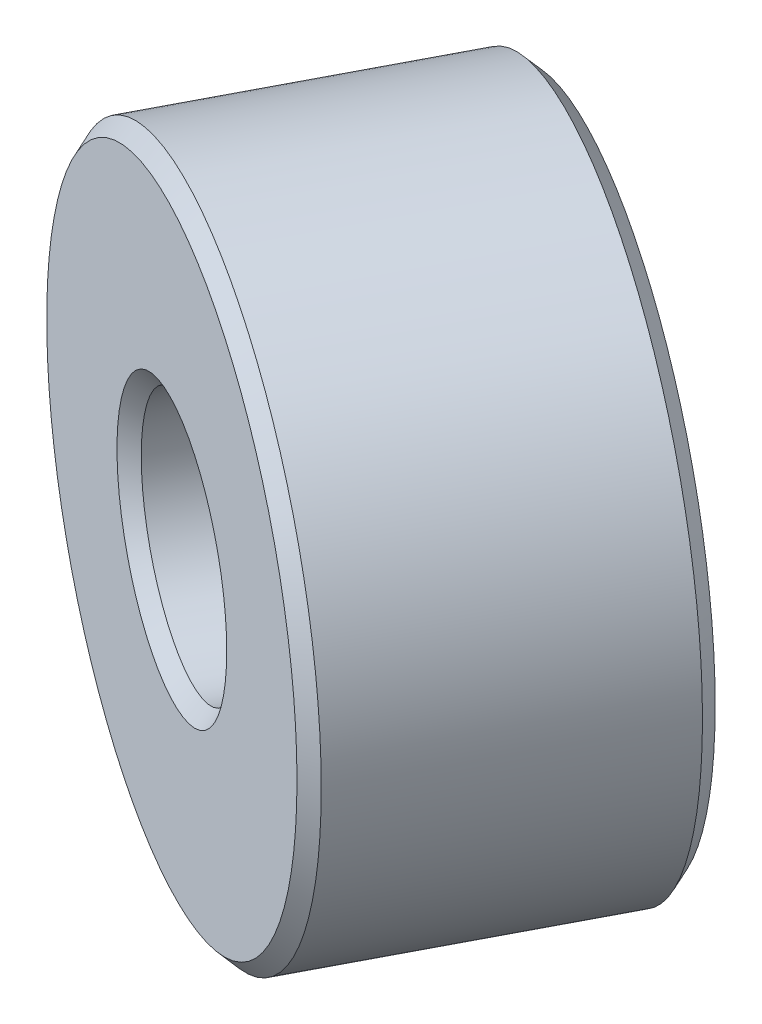
ISO-10303-21;
HEADER;
FILE_DESCRIPTION(('STEP AP214'),'2;1');
FILE_NAME('part.step','',(''),(''),'','','');
FILE_SCHEMA(('AUTOMOTIVE_DESIGN { 1 0 10303 214 1 1 1 1 }'));
ENDSEC;
DATA;
#1=APPLICATION_CONTEXT('core data for automotive mechanical design processes');
#2=APPLICATION_PROTOCOL_DEFINITION('international standard','automotive_design',2000,#1);
#3=PRODUCT_CONTEXT('',#1,'mechanical');
#4=PRODUCT('Part','Part','',(#3));
#5=PRODUCT_RELATED_PRODUCT_CATEGORY('part','',(#4));
#6=PRODUCT_DEFINITION_FORMATION('','',#4);
#7=PRODUCT_DEFINITION_CONTEXT('part definition',#1,'design');
#8=PRODUCT_DEFINITION('design','',#6,#7);
#9=PRODUCT_DEFINITION_SHAPE('','',#8);
#10=(LENGTH_UNIT() NAMED_UNIT(*) SI_UNIT(.MILLI.,.METRE.));
#11=(NAMED_UNIT(*) PLANE_ANGLE_UNIT() SI_UNIT($,.RADIAN.));
#12=(NAMED_UNIT(*) SI_UNIT($,.STERADIAN.) SOLID_ANGLE_UNIT());
#13=UNCERTAINTY_MEASURE_WITH_UNIT(LENGTH_MEASURE(1.E-05),#10,'distance_accuracy_value','');
#14=(GEOMETRIC_REPRESENTATION_CONTEXT(3) GLOBAL_UNCERTAINTY_ASSIGNED_CONTEXT((#13)) GLOBAL_UNIT_ASSIGNED_CONTEXT((#10,
#11,#12)) REPRESENTATION_CONTEXT('',''));
#15=CARTESIAN_POINT('',(0.,0.,0.));
#16=DIRECTION('',(0.,0.,1.));
#17=DIRECTION('',(1.,0.,0.));
#18=AXIS2_PLACEMENT_3D('',#15,#16,#17);
#19=CARTESIAN_POINT('',(-12.9986720704658,194.571784647721,24.8433680151721));
#20=DIRECTION('',(0.463600563550686,0.,-0.886044308979797));
#21=DIRECTION('',(-0.886044308979797,0.,-0.463600563550686));
#22=AXIS2_PLACEMENT_3D('',#19,#20,#21);
#23=CONICAL_SURFACE('',#22,4.,0.785398163397454);
#24=CARTESIAN_POINT('',(-13.080625846028,194.571784647721,25.));
#25=DIRECTION('',(-0.463600563550686,0.,0.886044308979797));
#26=DIRECTION('',(0.886044308979797,0.,0.463600563550686));
#27=AXIS2_PLACEMENT_3D('',#24,#25,#26);
#28=CIRCLE('',#27,3.82322330470336);
#29=CARTESIAN_POINT('',(-9.69308059493665,194.571784647721,26.7724484786406));
#30=VERTEX_POINT('',#29);
#31=EDGE_CURVE('E10',#30,#30,#28,.T.);
#32=ORIENTED_EDGE('',*,*,#31,.F.);
#33=EDGE_LOOP('',(#32));
#34=FACE_BOUND('',#33,.T.);
#35=CARTESIAN_POINT('',(-12.9986720704658,194.571784647721,24.8433680151721));
#36=DIRECTION('',(-0.463600563550686,0.,0.886044308979797));
#37=DIRECTION('',(0.886044308979797,0.,0.463600563550686));
#38=AXIS2_PLACEMENT_3D('',#35,#36,#37);
#39=CIRCLE('',#38,4.);
#40=CARTESIAN_POINT('',(-9.45449483454665,194.571784647721,26.6977702693749));
#41=VERTEX_POINT('',#40);
#42=EDGE_CURVE('E59',#41,#41,#39,.T.);
#43=ORIENTED_EDGE('',*,*,#42,.T.);
#44=EDGE_LOOP('',(#43));
#45=FACE_BOUND('',#44,.T.);
#46=ADVANCED_FACE('F31',(#34,#45),#23,.T.);
#47=CARTESIAN_POINT('',(-13.080625846028,198.395007952424,25.));
#48=DIRECTION('',(0.463600563550686,0.,-0.886044308979797));
#49=DIRECTION('',(-0.886044308979797,0.,-0.463600563550686));
#50=AXIS2_PLACEMENT_3D('',#47,#48,#49);
#51=PLANE('',#50);
#52=CARTESIAN_POINT('',(-13.080625846028,194.571784647721,25.));
#53=DIRECTION('',(-0.463600563550686,0.,0.886044308979797));
#54=DIRECTION('',(0.886044308979797,0.,0.463600563550686));
#55=AXIS2_PLACEMENT_3D('',#52,#53,#54);
#56=CIRCLE('',#55,1.67677669529662);
#57=CARTESIAN_POINT('',(-11.5949273977305,194.571784647721,25.7773546208882));
#58=VERTEX_POINT('',#57);
#59=EDGE_CURVE('E37',#58,#58,#56,.T.);
#60=ORIENTED_EDGE('',*,*,#59,.F.);
#61=EDGE_LOOP('',(#60));
#62=FACE_BOUND('',#61,.T.);
#63=ORIENTED_EDGE('',*,*,#31,.T.);
#64=EDGE_LOOP('',(#63));
#65=FACE_BOUND('',#64,.T.);
#66=ADVANCED_FACE('F96',(#62,#65),#51,.F.);
#67=CARTESIAN_POINT('',(-13.080625846028,194.571784647721,25.));
#68=DIRECTION('',(-0.463600563550686,0.,0.886044308979797));
#69=DIRECTION('',(0.886044308979797,0.,0.463600563550686));
#70=AXIS2_PLACEMENT_3D('',#67,#68,#69);
#71=CONICAL_SURFACE('',#70,1.67677669529662,0.785398163397386);
#72=CARTESIAN_POINT('',(-12.9986720704658,194.571784647721,24.8433680151722));
#73=DIRECTION('',(-0.463600563550686,0.,0.886044308979797));
#74=DIRECTION('',(0.886044308979797,0.,0.463600563550686));
#75=AXIS2_PLACEMENT_3D('',#72,#73,#74);
#76=CIRCLE('',#75,1.5);
#77=CARTESIAN_POINT('',(-11.6696056069962,194.571784647721,25.5387688604982));
#78=VERTEX_POINT('',#77);
#79=EDGE_CURVE('E41',#78,#78,#76,.T.);
#80=ORIENTED_EDGE('',*,*,#79,.F.);
#81=EDGE_LOOP('',(#80));
#82=FACE_BOUND('',#81,.T.);
#83=ORIENTED_EDGE('',*,*,#59,.T.);
#84=EDGE_LOOP('',(#83));
#85=FACE_BOUND('',#84,.T.);
#86=ADVANCED_FACE('F91',(#82,#85),#71,.F.);
#87=CARTESIAN_POINT('',(-13.080625846028,194.571784647721,25.));
#88=DIRECTION('',(-0.463600563550686,0.,0.886044308979797));
#89=DIRECTION('',(0.886044308979797,0.,0.463600563550686));
#90=AXIS2_PLACEMENT_3D('',#87,#88,#89);
#91=CYLINDRICAL_SURFACE('',#90,1.49999999999999);
#92=CARTESIAN_POINT('',(-11.3081773673874,194.571784647721,21.6124547489086));
#93=DIRECTION('',(-0.463600563550686,0.,0.886044308979797));
#94=DIRECTION('',(0.886044308979797,0.,0.463600563550686));
#95=AXIS2_PLACEMENT_3D('',#92,#93,#94);
#96=CIRCLE('',#95,1.49999999999997);
#97=CARTESIAN_POINT('',(-9.97911090391773,194.571784647721,22.3078555942347));
#98=VERTEX_POINT('',#97);
#99=EDGE_CURVE('E45',#98,#98,#96,.T.);
#100=ORIENTED_EDGE('',*,*,#99,.F.);
#101=EDGE_LOOP('',(#100));
#102=FACE_BOUND('',#101,.T.);
#103=ORIENTED_EDGE('',*,*,#79,.T.);
#104=EDGE_LOOP('',(#103));
#105=FACE_BOUND('',#104,.T.);
#106=ADVANCED_FACE('F85',(#102,#105),#91,.F.);
#107=CARTESIAN_POINT('',(-11.3081773673874,194.571784647721,21.6124547489086));
#108=DIRECTION('',(0.463600563550686,0.,-0.886044308979797));
#109=DIRECTION('',(-0.886044308979797,0.,-0.463600563550686));
#110=AXIS2_PLACEMENT_3D('',#107,#108,#109);
#111=CONICAL_SURFACE('',#110,1.49999999999997,0.785398163397462);
#112=CARTESIAN_POINT('',(-11.2262235918253,194.571784647721,21.4558227640808));
#113=DIRECTION('',(-0.463600563550686,0.,0.886044308979797));
#114=DIRECTION('',(0.886044308979797,0.,0.463600563550686));
#115=AXIS2_PLACEMENT_3D('',#112,#113,#114);
#116=CIRCLE('',#115,1.67677669529662);
#117=CARTESIAN_POINT('',(-9.74052514352773,194.571784647721,22.233177384969));
#118=VERTEX_POINT('',#117);
#119=EDGE_CURVE('E50',#118,#118,#116,.T.);
#120=ORIENTED_EDGE('',*,*,#119,.F.);
#121=EDGE_LOOP('',(#120));
#122=FACE_BOUND('',#121,.T.);
#123=ORIENTED_EDGE('',*,*,#99,.T.);
#124=EDGE_LOOP('',(#123));
#125=FACE_BOUND('',#124,.T.);
#126=ADVANCED_FACE('F79',(#122,#125),#111,.F.);
#127=CARTESIAN_POINT('',(-11.2262235918253,198.395007952424,21.4558227640808));
#128=DIRECTION('',(-0.463600563550686,0.,0.886044308979797));
#129=DIRECTION('',(0.886044308979797,0.,0.463600563550686));
#130=AXIS2_PLACEMENT_3D('',#127,#128,#129);
#131=PLANE('',#130);
#132=CARTESIAN_POINT('',(-11.2262235918253,194.571784647721,21.4558227640808));
#133=DIRECTION('',(-0.463600563550686,0.,0.886044308979797));
#134=DIRECTION('',(0.886044308979797,0.,0.463600563550686));
#135=AXIS2_PLACEMENT_3D('',#132,#133,#134);
#136=CIRCLE('',#135,3.82322330470336);
#137=CARTESIAN_POINT('',(-7.8386783407339,194.571784647721,23.2282712427214));
#138=VERTEX_POINT('',#137);
#139=EDGE_CURVE('E53',#138,#138,#136,.T.);
#140=ORIENTED_EDGE('',*,*,#139,.F.);
#141=EDGE_LOOP('',(#140));
#142=FACE_BOUND('',#141,.T.);
#143=ORIENTED_EDGE('',*,*,#119,.T.);
#144=EDGE_LOOP('',(#143));
#145=FACE_BOUND('',#144,.T.);
#146=ADVANCED_FACE('F73',(#142,#145),#131,.F.);
#147=CARTESIAN_POINT('',(-11.2262235918253,194.571784647721,21.4558227640808));
#148=DIRECTION('',(-0.463600563550686,0.,0.886044308979797));
#149=DIRECTION('',(0.886044308979797,0.,0.463600563550686));
#150=AXIS2_PLACEMENT_3D('',#147,#148,#149);
#151=CONICAL_SURFACE('',#150,3.82322330470336,0.785398163397462);
#152=CARTESIAN_POINT('',(-11.3081773673874,194.571784647721,21.6124547489086));
#153=DIRECTION('',(-0.463600563550686,0.,0.886044308979797));
#154=DIRECTION('',(0.886044308979797,0.,0.463600563550686));
#155=AXIS2_PLACEMENT_3D('',#152,#153,#154);
#156=CIRCLE('',#155,4.);
#157=CARTESIAN_POINT('',(-7.76400013146821,194.571784647721,23.4668570031114));
#158=VERTEX_POINT('',#157);
#159=EDGE_CURVE('E56',#158,#158,#156,.T.);
#160=ORIENTED_EDGE('',*,*,#159,.F.);
#161=EDGE_LOOP('',(#160));
#162=FACE_BOUND('',#161,.T.);
#163=ORIENTED_EDGE('',*,*,#139,.T.);
#164=EDGE_LOOP('',(#163));
#165=FACE_BOUND('',#164,.T.);
#166=ADVANCED_FACE('F67',(#162,#165),#151,.T.);
#167=CARTESIAN_POINT('',(-13.080625846028,194.571784647721,25.));
#168=DIRECTION('',(-0.463600563550686,0.,0.886044308979797));
#169=DIRECTION('',(0.886044308979797,0.,0.463600563550686));
#170=AXIS2_PLACEMENT_3D('',#167,#168,#169);
#171=CYLINDRICAL_SURFACE('',#170,4.);
#172=ORIENTED_EDGE('',*,*,#42,.F.);
#173=EDGE_LOOP('',(#172));
#174=FACE_BOUND('',#173,.T.);
#175=ORIENTED_EDGE('',*,*,#159,.T.);
#176=EDGE_LOOP('',(#175));
#177=FACE_BOUND('',#176,.T.);
#178=ADVANCED_FACE('F64',(#174,#177),#171,.T.);
#179=CLOSED_SHELL('',(#46,#66,#86,#106,#126,#146,#166,#178));
#180=MANIFOLD_SOLID_BREP('B2',#179);
#181=ADVANCED_BREP_SHAPE_REPRESENTATION('',(#18,#180),#14);
#182=SHAPE_DEFINITION_REPRESENTATION(#9,#181);
ENDSEC;
END-ISO-10303-21;
